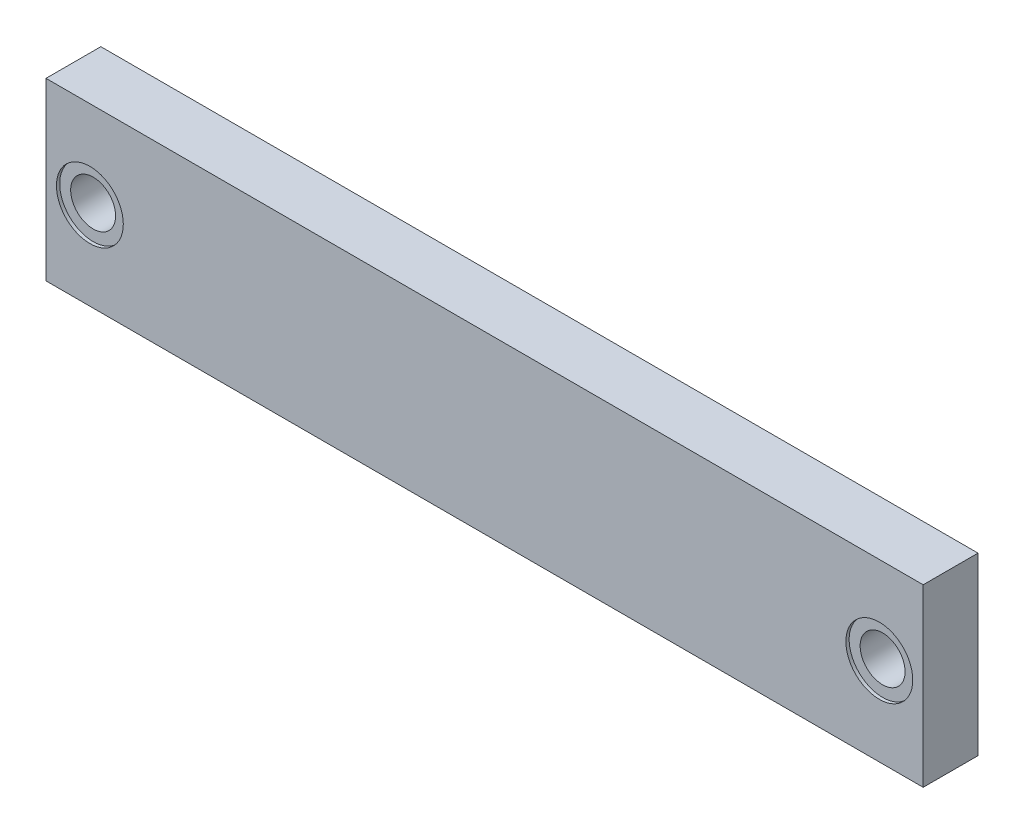
ISO-10303-21;
HEADER;
FILE_DESCRIPTION(('STEP AP214'),'2;1');
FILE_NAME('part.step','',(''),(''),'','','');
FILE_SCHEMA(('AUTOMOTIVE_DESIGN { 1 0 10303 214 1 1 1 1 }'));
ENDSEC;
DATA;
#1=APPLICATION_CONTEXT('core data for automotive mechanical design processes');
#2=APPLICATION_PROTOCOL_DEFINITION('international standard','automotive_design',2000,#1);
#3=PRODUCT_CONTEXT('',#1,'mechanical');
#4=PRODUCT('Part','Part','',(#3));
#5=PRODUCT_RELATED_PRODUCT_CATEGORY('part','',(#4));
#6=PRODUCT_DEFINITION_FORMATION('','',#4);
#7=PRODUCT_DEFINITION_CONTEXT('part definition',#1,'design');
#8=PRODUCT_DEFINITION('design','',#6,#7);
#9=PRODUCT_DEFINITION_SHAPE('','',#8);
#10=(LENGTH_UNIT() NAMED_UNIT(*) SI_UNIT(.MILLI.,.METRE.));
#11=(NAMED_UNIT(*) PLANE_ANGLE_UNIT() SI_UNIT($,.RADIAN.));
#12=(NAMED_UNIT(*) SI_UNIT($,.STERADIAN.) SOLID_ANGLE_UNIT());
#13=UNCERTAINTY_MEASURE_WITH_UNIT(LENGTH_MEASURE(1.E-05),#10,'distance_accuracy_value','');
#14=(GEOMETRIC_REPRESENTATION_CONTEXT(3) GLOBAL_UNCERTAINTY_ASSIGNED_CONTEXT((#13)) GLOBAL_UNIT_ASSIGNED_CONTEXT((#10,
#11,#12)) REPRESENTATION_CONTEXT('',''));
#15=CARTESIAN_POINT('',(0.,0.,0.));
#16=DIRECTION('',(0.,0.,1.));
#17=DIRECTION('',(1.,0.,0.));
#18=AXIS2_PLACEMENT_3D('',#15,#16,#17);
#19=CARTESIAN_POINT('',(35.708348754,-12.,17.6));
#20=DIRECTION('',(0.,0.,-1.));
#21=DIRECTION('',(-1.,0.,0.));
#22=AXIS2_PLACEMENT_3D('',#19,#20,#21);
#23=CYLINDRICAL_SURFACE('',#22,2.05);
#24=CARTESIAN_POINT('',(35.708348754,-12.,12.8));
#25=DIRECTION('',(0.,0.,1.));
#26=DIRECTION('',(1.,0.,0.));
#27=AXIS2_PLACEMENT_3D('',#24,#25,#26);
#28=CIRCLE('',#27,2.05);
#29=CARTESIAN_POINT('',(37.758348754,-12.,12.8));
#30=VERTEX_POINT('',#29);
#31=EDGE_CURVE('E127',#30,#30,#28,.T.);
#32=ORIENTED_EDGE('',*,*,#31,.F.);
#33=EDGE_LOOP('',(#32));
#34=FACE_BOUND('',#33,.T.);
#35=CARTESIAN_POINT('',(35.708348754,-12.,17.2));
#36=DIRECTION('',(0.,0.,1.));
#37=DIRECTION('',(1.,0.,0.));
#38=AXIS2_PLACEMENT_3D('',#35,#36,#37);
#39=CIRCLE('',#38,2.05);
#40=CARTESIAN_POINT('',(37.758348754,-12.,17.2));
#41=VERTEX_POINT('',#40);
#42=EDGE_CURVE('E136',#41,#41,#39,.T.);
#43=ORIENTED_EDGE('',*,*,#42,.T.);
#44=EDGE_LOOP('',(#43));
#45=FACE_BOUND('',#44,.T.);
#46=ADVANCED_FACE('F41',(#34,#45),#23,.F.);
#47=CARTESIAN_POINT('',(-36.291651246,-12.,17.6));
#48=DIRECTION('',(0.,0.,-1.));
#49=DIRECTION('',(-1.,0.,0.));
#50=AXIS2_PLACEMENT_3D('',#47,#48,#49);
#51=CYLINDRICAL_SURFACE('',#50,2.05);
#52=CARTESIAN_POINT('',(-36.291651246,-12.,12.8));
#53=DIRECTION('',(0.,0.,1.));
#54=DIRECTION('',(1.,0.,0.));
#55=AXIS2_PLACEMENT_3D('',#52,#53,#54);
#56=CIRCLE('',#55,2.05);
#57=CARTESIAN_POINT('',(-34.241651246,-12.,12.8));
#58=VERTEX_POINT('',#57);
#59=EDGE_CURVE('E120',#58,#58,#56,.T.);
#60=ORIENTED_EDGE('',*,*,#59,.F.);
#61=EDGE_LOOP('',(#60));
#62=FACE_BOUND('',#61,.T.);
#63=CARTESIAN_POINT('',(-36.291651246,-12.,17.2));
#64=DIRECTION('',(0.,0.,1.));
#65=DIRECTION('',(1.,0.,0.));
#66=AXIS2_PLACEMENT_3D('',#63,#64,#65);
#67=CIRCLE('',#66,2.05);
#68=CARTESIAN_POINT('',(-34.241651246,-12.,17.2));
#69=VERTEX_POINT('',#68);
#70=EDGE_CURVE('E124',#69,#69,#67,.T.);
#71=ORIENTED_EDGE('',*,*,#70,.T.);
#72=EDGE_LOOP('',(#71));
#73=FACE_BOUND('',#72,.T.);
#74=ADVANCED_FACE('F173',(#62,#73),#51,.F.);
#75=CARTESIAN_POINT('',(-40.291651246,-4.,17.5));
#76=DIRECTION('',(1.,0.,0.));
#77=DIRECTION('',(0.,0.,-1.));
#78=AXIS2_PLACEMENT_3D('',#75,#76,#77);
#79=PLANE('',#78);
#80=DIRECTION('',(0.,-1.,0.));
#81=VECTOR('',#80,1.);
#82=CARTESIAN_POINT('',(-40.291651246,-4.,12.5));
#83=LINE('',#82,#81);
#84=CARTESIAN_POINT('',(-40.291651246,-4.,12.5));
#85=VERTEX_POINT('',#84);
#86=CARTESIAN_POINT('',(-40.291651246,-20.,12.5));
#87=VERTEX_POINT('',#86);
#88=EDGE_CURVE('E108',#85,#87,#83,.T.);
#89=ORIENTED_EDGE('',*,*,#88,.T.);
#90=DIRECTION('',(0.,0.,-1.));
#91=VECTOR('',#90,1.);
#92=CARTESIAN_POINT('',(-40.291651246,-20.,17.5));
#93=LINE('',#92,#91);
#94=CARTESIAN_POINT('',(-40.291651246,-20.,17.5));
#95=VERTEX_POINT('',#94);
#96=EDGE_CURVE('E11',#95,#87,#93,.T.);
#97=ORIENTED_EDGE('',*,*,#96,.F.);
#98=DIRECTION('',(0.,-1.,0.));
#99=VECTOR('',#98,1.);
#100=CARTESIAN_POINT('',(-40.291651246,-4.,17.5));
#101=LINE('',#100,#99);
#102=CARTESIAN_POINT('',(-40.291651246,-4.,17.5));
#103=VERTEX_POINT('',#102);
#104=EDGE_CURVE('E94',#103,#95,#101,.T.);
#105=ORIENTED_EDGE('',*,*,#104,.F.);
#106=DIRECTION('',(0.,0.,-1.));
#107=VECTOR('',#106,1.);
#108=CARTESIAN_POINT('',(-40.291651246,-4.,17.5));
#109=LINE('',#108,#107);
#110=EDGE_CURVE('E104',#103,#85,#109,.T.);
#111=ORIENTED_EDGE('',*,*,#110,.T.);
#112=EDGE_LOOP('',(#89,#97,#105,#111));
#113=FACE_BOUND('',#112,.T.);
#114=ADVANCED_FACE('F43',(#113),#79,.F.);
#115=CARTESIAN_POINT('',(-40.291651246,-20.,17.5));
#116=DIRECTION('',(0.,1.,0.));
#117=DIRECTION('',(0.,0.,1.));
#118=AXIS2_PLACEMENT_3D('',#115,#116,#117);
#119=PLANE('',#118);
#120=DIRECTION('',(1.,0.,0.));
#121=VECTOR('',#120,1.);
#122=CARTESIAN_POINT('',(-40.291651246,-20.,12.5));
#123=LINE('',#122,#121);
#124=CARTESIAN_POINT('',(39.708348754,-20.,12.5));
#125=VERTEX_POINT('',#124);
#126=EDGE_CURVE('E100',#87,#125,#123,.T.);
#127=ORIENTED_EDGE('',*,*,#126,.T.);
#128=DIRECTION('',(0.,0.,-1.));
#129=VECTOR('',#128,1.);
#130=CARTESIAN_POINT('',(39.708348754,-20.,17.5));
#131=LINE('',#130,#129);
#132=CARTESIAN_POINT('',(39.708348754,-20.,17.5));
#133=VERTEX_POINT('',#132);
#134=EDGE_CURVE('E51',#133,#125,#131,.T.);
#135=ORIENTED_EDGE('',*,*,#134,.F.);
#136=DIRECTION('',(1.,0.,0.));
#137=VECTOR('',#136,1.);
#138=CARTESIAN_POINT('',(-40.291651246,-20.,17.5));
#139=LINE('',#138,#137);
#140=EDGE_CURVE('E89',#95,#133,#139,.T.);
#141=ORIENTED_EDGE('',*,*,#140,.F.);
#142=ORIENTED_EDGE('',*,*,#96,.T.);
#143=EDGE_LOOP('',(#127,#135,#141,#142));
#144=FACE_BOUND('',#143,.T.);
#145=ADVANCED_FACE('F96',(#144),#119,.F.);
#146=CARTESIAN_POINT('',(39.708348754,-20.,17.5));
#147=DIRECTION('',(-1.,0.,0.));
#148=DIRECTION('',(0.,0.,1.));
#149=AXIS2_PLACEMENT_3D('',#146,#147,#148);
#150=PLANE('',#149);
#151=DIRECTION('',(0.,1.,0.));
#152=VECTOR('',#151,1.);
#153=CARTESIAN_POINT('',(39.708348754,-20.,12.5));
#154=LINE('',#153,#152);
#155=CARTESIAN_POINT('',(39.708348754,-4.,12.5));
#156=VERTEX_POINT('',#155);
#157=EDGE_CURVE('E80',#125,#156,#154,.T.);
#158=ORIENTED_EDGE('',*,*,#157,.T.);
#159=DIRECTION('',(0.,0.,-1.));
#160=VECTOR('',#159,1.);
#161=CARTESIAN_POINT('',(39.708348754,-4.,17.5));
#162=LINE('',#161,#160);
#163=CARTESIAN_POINT('',(39.708348754,-4.,17.5));
#164=VERTEX_POINT('',#163);
#165=EDGE_CURVE('E99',#164,#156,#162,.T.);
#166=ORIENTED_EDGE('',*,*,#165,.F.);
#167=DIRECTION('',(0.,1.,0.));
#168=VECTOR('',#167,1.);
#169=CARTESIAN_POINT('',(39.708348754,-20.,17.5));
#170=LINE('',#169,#168);
#171=EDGE_CURVE('E92',#133,#164,#170,.T.);
#172=ORIENTED_EDGE('',*,*,#171,.F.);
#173=ORIENTED_EDGE('',*,*,#134,.T.);
#174=EDGE_LOOP('',(#158,#166,#172,#173));
#175=FACE_BOUND('',#174,.T.);
#176=ADVANCED_FACE('F105',(#175),#150,.F.);
#177=CARTESIAN_POINT('',(39.708348754,-4.,17.5));
#178=DIRECTION('',(0.,-1.,0.));
#179=DIRECTION('',(0.,0.,-1.));
#180=AXIS2_PLACEMENT_3D('',#177,#178,#179);
#181=PLANE('',#180);
#182=DIRECTION('',(-1.,0.,0.));
#183=VECTOR('',#182,1.);
#184=CARTESIAN_POINT('',(39.708348754,-4.,12.5));
#185=LINE('',#184,#183);
#186=EDGE_CURVE('E85',#156,#85,#185,.T.);
#187=ORIENTED_EDGE('',*,*,#186,.T.);
#188=ORIENTED_EDGE('',*,*,#110,.F.);
#189=DIRECTION('',(-1.,0.,0.));
#190=VECTOR('',#189,1.);
#191=CARTESIAN_POINT('',(39.708348754,-4.,17.5));
#192=LINE('',#191,#190);
#193=EDGE_CURVE('E58',#164,#103,#192,.T.);
#194=ORIENTED_EDGE('',*,*,#193,.F.);
#195=ORIENTED_EDGE('',*,*,#165,.T.);
#196=EDGE_LOOP('',(#187,#188,#194,#195));
#197=FACE_BOUND('',#196,.T.);
#198=ADVANCED_FACE('F213',(#197),#181,.F.);
#199=CARTESIAN_POINT('',(0.,0.,17.5));
#200=DIRECTION('',(0.,0.,1.));
#201=DIRECTION('',(1.,0.,0.));
#202=AXIS2_PLACEMENT_3D('',#199,#200,#201);
#203=PLANE('',#202);
#204=CARTESIAN_POINT('',(35.708348754,-12.,17.5));
#205=DIRECTION('',(0.,0.,1.));
#206=DIRECTION('',(1.,0.,0.));
#207=AXIS2_PLACEMENT_3D('',#204,#205,#206);
#208=CIRCLE('',#207,3.05);
#209=CARTESIAN_POINT('',(38.758348754,-12.,17.5));
#210=VERTEX_POINT('',#209);
#211=EDGE_CURVE('E44',#210,#210,#208,.F.);
#212=ORIENTED_EDGE('',*,*,#211,.T.);
#213=EDGE_LOOP('',(#212));
#214=FACE_BOUND('',#213,.T.);
#215=CARTESIAN_POINT('',(-36.291651246,-12.,17.5));
#216=DIRECTION('',(0.,0.,1.));
#217=DIRECTION('',(1.,0.,0.));
#218=AXIS2_PLACEMENT_3D('',#215,#216,#217);
#219=CIRCLE('',#218,3.05);
#220=CARTESIAN_POINT('',(-33.241651246,-12.,17.5));
#221=VERTEX_POINT('',#220);
#222=EDGE_CURVE('E129',#221,#221,#219,.F.);
#223=ORIENTED_EDGE('',*,*,#222,.T.);
#224=EDGE_LOOP('',(#223));
#225=FACE_BOUND('',#224,.T.);
#226=ORIENTED_EDGE('',*,*,#104,.T.);
#227=ORIENTED_EDGE('',*,*,#140,.T.);
#228=ORIENTED_EDGE('',*,*,#171,.T.);
#229=ORIENTED_EDGE('',*,*,#193,.T.);
#230=EDGE_LOOP('',(#226,#227,#228,#229));
#231=FACE_BOUND('',#230,.T.);
#232=ADVANCED_FACE('F91',(#214,#225,#231),#203,.T.);
#233=CARTESIAN_POINT('',(0.,0.,12.5));
#234=DIRECTION('',(0.,0.,1.));
#235=DIRECTION('',(1.,0.,0.));
#236=AXIS2_PLACEMENT_3D('',#233,#234,#235);
#237=PLANE('',#236);
#238=CARTESIAN_POINT('',(35.708348754,-12.,12.5));
#239=DIRECTION('',(0.,0.,1.));
#240=DIRECTION('',(1.,0.,0.));
#241=AXIS2_PLACEMENT_3D('',#238,#239,#240);
#242=CIRCLE('',#241,3.05);
#243=CARTESIAN_POINT('',(38.758348754,-12.,12.5));
#244=VERTEX_POINT('',#243);
#245=EDGE_CURVE('E133',#244,#244,#242,.F.);
#246=ORIENTED_EDGE('',*,*,#245,.F.);
#247=EDGE_LOOP('',(#246));
#248=FACE_BOUND('',#247,.T.);
#249=CARTESIAN_POINT('',(-36.291651246,-12.,12.5));
#250=DIRECTION('',(0.,0.,1.));
#251=DIRECTION('',(1.,0.,0.));
#252=AXIS2_PLACEMENT_3D('',#249,#250,#251);
#253=CIRCLE('',#252,3.05);
#254=CARTESIAN_POINT('',(-33.241651246,-12.,12.5));
#255=VERTEX_POINT('',#254);
#256=EDGE_CURVE('E111',#255,#255,#253,.F.);
#257=ORIENTED_EDGE('',*,*,#256,.F.);
#258=EDGE_LOOP('',(#257));
#259=FACE_BOUND('',#258,.T.);
#260=ORIENTED_EDGE('',*,*,#88,.F.);
#261=ORIENTED_EDGE('',*,*,#186,.F.);
#262=ORIENTED_EDGE('',*,*,#157,.F.);
#263=ORIENTED_EDGE('',*,*,#126,.F.);
#264=EDGE_LOOP('',(#260,#261,#262,#263));
#265=FACE_BOUND('',#264,.T.);
#266=ADVANCED_FACE('F167',(#248,#259,#265),#237,.F.);
#267=CARTESIAN_POINT('',(-36.291651246,-12.,12.8));
#268=DIRECTION('',(0.,0.,-1.));
#269=DIRECTION('',(-1.,0.,0.));
#270=AXIS2_PLACEMENT_3D('',#267,#268,#269);
#271=CYLINDRICAL_SURFACE('',#270,3.05);
#272=CARTESIAN_POINT('',(-36.291651246,-12.,12.8));
#273=DIRECTION('',(0.,0.,1.));
#274=DIRECTION('',(1.,0.,0.));
#275=AXIS2_PLACEMENT_3D('',#272,#273,#274);
#276=CIRCLE('',#275,3.05);
#277=CARTESIAN_POINT('',(-33.241651246,-12.,12.8));
#278=VERTEX_POINT('',#277);
#279=EDGE_CURVE('E119',#278,#278,#276,.T.);
#280=ORIENTED_EDGE('',*,*,#279,.T.);
#281=EDGE_LOOP('',(#280));
#282=FACE_BOUND('',#281,.T.);
#283=ORIENTED_EDGE('',*,*,#256,.T.);
#284=EDGE_LOOP('',(#283));
#285=FACE_BOUND('',#284,.T.);
#286=ADVANCED_FACE('F152',(#282,#285),#271,.F.);
#287=CARTESIAN_POINT('',(-36.291651246,-12.,12.8));
#288=DIRECTION('',(0.,0.,1.));
#289=DIRECTION('',(1.,0.,0.));
#290=AXIS2_PLACEMENT_3D('',#287,#288,#289);
#291=PLANE('',#290);
#292=ORIENTED_EDGE('',*,*,#59,.T.);
#293=EDGE_LOOP('',(#292));
#294=FACE_BOUND('',#293,.T.);
#295=ORIENTED_EDGE('',*,*,#279,.F.);
#296=EDGE_LOOP('',(#295));
#297=FACE_BOUND('',#296,.T.);
#298=ADVANCED_FACE('F160',(#294,#297),#291,.F.);
#299=CARTESIAN_POINT('',(-36.291651246,-12.,17.6));
#300=DIRECTION('',(0.,0.,-1.));
#301=DIRECTION('',(-1.,0.,0.));
#302=AXIS2_PLACEMENT_3D('',#299,#300,#301);
#303=CYLINDRICAL_SURFACE('',#302,3.05);
#304=ORIENTED_EDGE('',*,*,#222,.F.);
#305=EDGE_LOOP('',(#304));
#306=FACE_BOUND('',#305,.T.);
#307=CARTESIAN_POINT('',(-36.291651246,-12.,17.2));
#308=DIRECTION('',(0.,0.,1.));
#309=DIRECTION('',(1.,0.,0.));
#310=AXIS2_PLACEMENT_3D('',#307,#308,#309);
#311=CIRCLE('',#310,3.05);
#312=CARTESIAN_POINT('',(-33.241651246,-12.,17.2));
#313=VERTEX_POINT('',#312);
#314=EDGE_CURVE('E126',#313,#313,#311,.T.);
#315=ORIENTED_EDGE('',*,*,#314,.F.);
#316=EDGE_LOOP('',(#315));
#317=FACE_BOUND('',#316,.T.);
#318=ADVANCED_FACE('F158',(#306,#317),#303,.F.);
#319=CARTESIAN_POINT('',(-36.291651246,-12.,17.2));
#320=DIRECTION('',(0.,0.,1.));
#321=DIRECTION('',(1.,0.,0.));
#322=AXIS2_PLACEMENT_3D('',#319,#320,#321);
#323=PLANE('',#322);
#324=ORIENTED_EDGE('',*,*,#70,.F.);
#325=EDGE_LOOP('',(#324));
#326=FACE_BOUND('',#325,.T.);
#327=ORIENTED_EDGE('',*,*,#314,.T.);
#328=EDGE_LOOP('',(#327));
#329=FACE_BOUND('',#328,.T.);
#330=ADVANCED_FACE('F170',(#326,#329),#323,.T.);
#331=CARTESIAN_POINT('',(35.708348754,-12.,12.8));
#332=DIRECTION('',(0.,0.,-1.));
#333=DIRECTION('',(-1.,0.,0.));
#334=AXIS2_PLACEMENT_3D('',#331,#332,#333);
#335=CYLINDRICAL_SURFACE('',#334,3.05);
#336=CARTESIAN_POINT('',(35.708348754,-12.,12.8));
#337=DIRECTION('',(0.,0.,1.));
#338=DIRECTION('',(1.,0.,0.));
#339=AXIS2_PLACEMENT_3D('',#336,#337,#338);
#340=CIRCLE('',#339,3.05);
#341=CARTESIAN_POINT('',(38.758348754,-12.,12.8));
#342=VERTEX_POINT('',#341);
#343=EDGE_CURVE('E132',#342,#342,#340,.T.);
#344=ORIENTED_EDGE('',*,*,#343,.T.);
#345=EDGE_LOOP('',(#344));
#346=FACE_BOUND('',#345,.T.);
#347=ORIENTED_EDGE('',*,*,#245,.T.);
#348=EDGE_LOOP('',(#347));
#349=FACE_BOUND('',#348,.T.);
#350=ADVANCED_FACE('F184',(#346,#349),#335,.F.);
#351=CARTESIAN_POINT('',(35.708348754,-12.,12.8));
#352=DIRECTION('',(0.,0.,1.));
#353=DIRECTION('',(1.,0.,0.));
#354=AXIS2_PLACEMENT_3D('',#351,#352,#353);
#355=PLANE('',#354);
#356=ORIENTED_EDGE('',*,*,#31,.T.);
#357=EDGE_LOOP('',(#356));
#358=FACE_BOUND('',#357,.T.);
#359=ORIENTED_EDGE('',*,*,#343,.F.);
#360=EDGE_LOOP('',(#359));
#361=FACE_BOUND('',#360,.T.);
#362=ADVANCED_FACE('F195',(#358,#361),#355,.F.);
#363=CARTESIAN_POINT('',(35.708348754,-12.,17.6));
#364=DIRECTION('',(0.,0.,-1.));
#365=DIRECTION('',(-1.,0.,0.));
#366=AXIS2_PLACEMENT_3D('',#363,#364,#365);
#367=CYLINDRICAL_SURFACE('',#366,3.05);
#368=ORIENTED_EDGE('',*,*,#211,.F.);
#369=EDGE_LOOP('',(#368));
#370=FACE_BOUND('',#369,.T.);
#371=CARTESIAN_POINT('',(35.708348754,-12.,17.2));
#372=DIRECTION('',(0.,0.,1.));
#373=DIRECTION('',(1.,0.,0.));
#374=AXIS2_PLACEMENT_3D('',#371,#372,#373);
#375=CIRCLE('',#374,3.05);
#376=CARTESIAN_POINT('',(38.758348754,-12.,17.2));
#377=VERTEX_POINT('',#376);
#378=EDGE_CURVE('E137',#377,#377,#375,.T.);
#379=ORIENTED_EDGE('',*,*,#378,.F.);
#380=EDGE_LOOP('',(#379));
#381=FACE_BOUND('',#380,.T.);
#382=ADVANCED_FACE('F205',(#370,#381),#367,.F.);
#383=CARTESIAN_POINT('',(35.708348754,-12.,17.2));
#384=DIRECTION('',(0.,0.,1.));
#385=DIRECTION('',(1.,0.,0.));
#386=AXIS2_PLACEMENT_3D('',#383,#384,#385);
#387=PLANE('',#386);
#388=ORIENTED_EDGE('',*,*,#42,.F.);
#389=EDGE_LOOP('',(#388));
#390=FACE_BOUND('',#389,.T.);
#391=ORIENTED_EDGE('',*,*,#378,.T.);
#392=EDGE_LOOP('',(#391));
#393=FACE_BOUND('',#392,.T.);
#394=ADVANCED_FACE('F302',(#390,#393),#387,.T.);
#395=CLOSED_SHELL('',(#46,#74,#114,#145,#176,#198,#232,#266,#286,#298,#318,#330,#350,#362,#382,#394));
#396=MANIFOLD_SOLID_BREP('B2',#395);
#397=ADVANCED_BREP_SHAPE_REPRESENTATION('',(#18,#396),#14);
#398=SHAPE_DEFINITION_REPRESENTATION(#9,#397);
ENDSEC;
END-ISO-10303-21;
